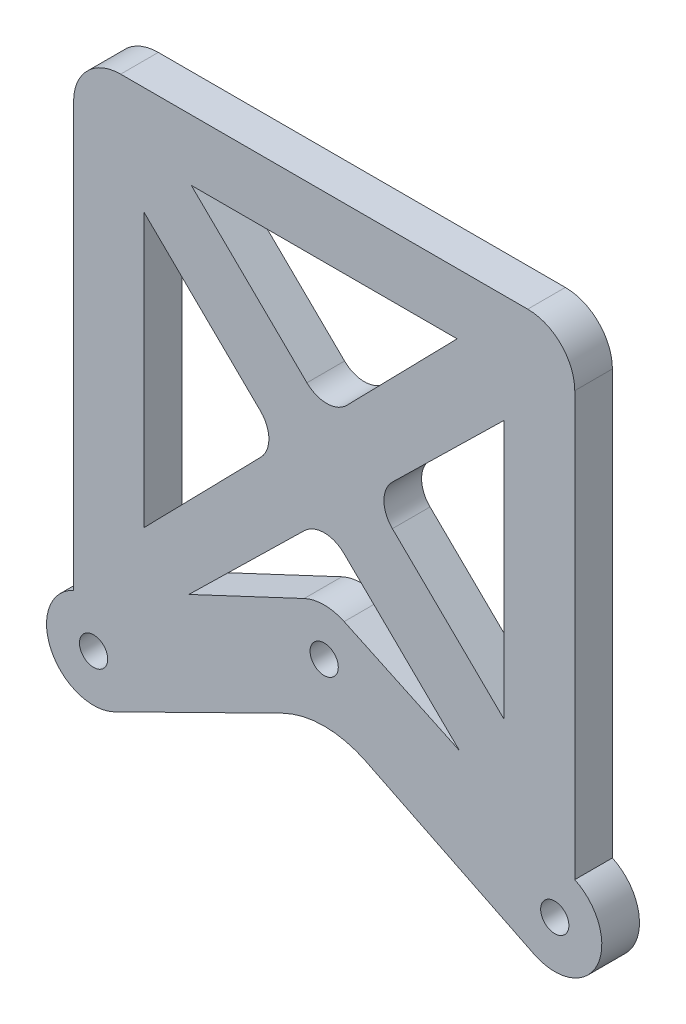
ISO-10303-21;
HEADER;
FILE_DESCRIPTION(('STEP AP214'),'2;1');
FILE_NAME('part.step','',(''),(''),'','','');
FILE_SCHEMA(('AUTOMOTIVE_DESIGN { 1 0 10303 214 1 1 1 1 }'));
ENDSEC;
DATA;
#1=APPLICATION_CONTEXT('core data for automotive mechanical design processes');
#2=APPLICATION_PROTOCOL_DEFINITION('international standard','automotive_design',2000,#1);
#3=PRODUCT_CONTEXT('',#1,'mechanical');
#4=PRODUCT('Part','Part','',(#3));
#5=PRODUCT_RELATED_PRODUCT_CATEGORY('part','',(#4));
#6=PRODUCT_DEFINITION_FORMATION('','',#4);
#7=PRODUCT_DEFINITION_CONTEXT('part definition',#1,'design');
#8=PRODUCT_DEFINITION('design','',#6,#7);
#9=PRODUCT_DEFINITION_SHAPE('','',#8);
#10=(LENGTH_UNIT() NAMED_UNIT(*) SI_UNIT(.MILLI.,.METRE.));
#11=(NAMED_UNIT(*) PLANE_ANGLE_UNIT() SI_UNIT($,.RADIAN.));
#12=(NAMED_UNIT(*) SI_UNIT($,.STERADIAN.) SOLID_ANGLE_UNIT());
#13=UNCERTAINTY_MEASURE_WITH_UNIT(LENGTH_MEASURE(1.E-05),#10,'distance_accuracy_value','');
#14=(GEOMETRIC_REPRESENTATION_CONTEXT(3) GLOBAL_UNCERTAINTY_ASSIGNED_CONTEXT((#13)) GLOBAL_UNIT_ASSIGNED_CONTEXT((#10,
#11,#12)) REPRESENTATION_CONTEXT('',''));
#15=CARTESIAN_POINT('',(0.,0.,0.));
#16=DIRECTION('',(0.,0.,1.));
#17=DIRECTION('',(1.,0.,0.));
#18=AXIS2_PLACEMENT_3D('',#15,#16,#17);
#19=CARTESIAN_POINT('',(-11.0513236983321,10.8109381402595,4.));
#20=DIRECTION('',(0.714838532622868,-0.699289548239916,0.));
#21=DIRECTION('',(0.699289548239916,0.714838532622868,0.));
#22=AXIS2_PLACEMENT_3D('',#19,#20,#21);
#23=PLANE('',#22);
#24=DIRECTION('',(-0.699289548239916,-0.714838532622868,0.));
#25=VECTOR('',#24,1.);
#26=CARTESIAN_POINT('',(-11.0513236983321,10.8109381402595,0.));
#27=LINE('',#26,#25);
#28=CARTESIAN_POINT('',(14.1245356850693,36.5465928836305,0.));
#29=VERTEX_POINT('',#28);
#30=CARTESIAN_POINT('',(2.40844254340268,24.5699876983511,0.));
#31=VERTEX_POINT('',#30);
#32=EDGE_CURVE('E330',#29,#31,#27,.T.);
#33=ORIENTED_EDGE('',*,*,#32,.T.);
#34=DIRECTION('',(0.,0.,-1.));
#35=VECTOR('',#34,1.);
#36=CARTESIAN_POINT('',(2.40844254340268,24.5699876983511,4.));
#37=LINE('',#36,#35);
#38=CARTESIAN_POINT('',(2.40844254340268,24.5699876983511,4.));
#39=VERTEX_POINT('',#38);
#40=EDGE_CURVE('E11',#39,#31,#37,.T.);
#41=ORIENTED_EDGE('',*,*,#40,.F.);
#42=DIRECTION('',(-0.699289548239916,-0.714838532622868,0.));
#43=VECTOR('',#42,1.);
#44=CARTESIAN_POINT('',(-11.0513236983321,10.8109381402595,4.));
#45=LINE('',#44,#43);
#46=CARTESIAN_POINT('',(14.1245356850693,36.5465928836305,4.));
#47=VERTEX_POINT('',#46);
#48=EDGE_CURVE('E235',#47,#39,#45,.T.);
#49=ORIENTED_EDGE('',*,*,#48,.F.);
#50=DIRECTION('',(0.,0.,-1.));
#51=VECTOR('',#50,1.);
#52=CARTESIAN_POINT('',(14.1245356850693,36.5465928836305,4.));
#53=LINE('',#52,#51);
#54=EDGE_CURVE('E338',#47,#29,#53,.T.);
#55=ORIENTED_EDGE('',*,*,#54,.T.);
#56=EDGE_LOOP('',(#33,#41,#49,#55));
#57=FACE_BOUND('',#56,.T.);
#58=ADVANCED_FACE('F38',(#57),#23,.F.);
#59=CARTESIAN_POINT('',(0.26392694553406,26.6678563430708,4.));
#60=DIRECTION('',(0.,0.,-1.));
#61=DIRECTION('',(-1.,0.,0.));
#62=AXIS2_PLACEMENT_3D('',#59,#60,#61);
#63=CYLINDRICAL_SURFACE('',#62,3.);
#64=CARTESIAN_POINT('',(0.26392694553406,26.6678563430708,0.));
#65=DIRECTION('',(0.,0.,1.));
#66=DIRECTION('',(1.,0.,0.));
#67=AXIS2_PLACEMENT_3D('',#64,#65,#66);
#68=CIRCLE('',#67,3.);
#69=CARTESIAN_POINT('',(-1.8339416991857,24.5233407452022,0.));
#70=VERTEX_POINT('',#69);
#71=EDGE_CURVE('E241',#31,#70,#68,.F.);
#72=ORIENTED_EDGE('',*,*,#71,.T.);
#73=DIRECTION('',(0.,0.,-1.));
#74=VECTOR('',#73,1.);
#75=CARTESIAN_POINT('',(-1.8339416991857,24.5233407452022,4.));
#76=LINE('',#75,#74);
#77=CARTESIAN_POINT('',(-1.8339416991857,24.5233407452022,4.));
#78=VERTEX_POINT('',#77);
#79=EDGE_CURVE('E48',#78,#70,#76,.T.);
#80=ORIENTED_EDGE('',*,*,#79,.F.);
#81=CARTESIAN_POINT('',(0.26392694553406,26.6678563430708,4.));
#82=DIRECTION('',(0.,0.,1.));
#83=DIRECTION('',(1.,0.,0.));
#84=AXIS2_PLACEMENT_3D('',#81,#82,#83);
#85=CIRCLE('',#84,3.);
#86=EDGE_CURVE('E229',#39,#78,#85,.F.);
#87=ORIENTED_EDGE('',*,*,#86,.F.);
#88=ORIENTED_EDGE('',*,*,#40,.T.);
#89=EDGE_LOOP('',(#72,#80,#87,#88));
#90=FACE_BOUND('',#89,.T.);
#91=ADVANCED_FACE('F240',(#90),#63,.F.);
#92=CARTESIAN_POINT('',(11.361897597015,11.614533960223,4.));
#93=DIRECTION('',(0.699289548239916,0.714838532622868,0.));
#94=DIRECTION('',(-0.714838532622868,0.699289548239916,0.));
#95=AXIS2_PLACEMENT_3D('',#92,#93,#94);
#96=PLANE('',#95);
#97=DIRECTION('',(0.714838532622868,-0.699289548239916,0.));
#98=VECTOR('',#97,1.);
#99=CARTESIAN_POINT('',(11.361897597015,11.614533960223,0.));
#100=LINE('',#99,#98);
#101=CARTESIAN_POINT('',(-14.1245356850693,36.5465928836305,0.));
#102=VERTEX_POINT('',#101);
#103=EDGE_CURVE('E334',#102,#70,#100,.T.);
#104=ORIENTED_EDGE('',*,*,#103,.F.);
#105=DIRECTION('',(0.,0.,-1.));
#106=VECTOR('',#105,1.);
#107=CARTESIAN_POINT('',(-14.1245356850693,36.5465928836305,4.));
#108=LINE('',#107,#106);
#109=CARTESIAN_POINT('',(-14.1245356850693,36.5465928836305,4.));
#110=VERTEX_POINT('',#109);
#111=EDGE_CURVE('E145',#110,#102,#108,.T.);
#112=ORIENTED_EDGE('',*,*,#111,.F.);
#113=DIRECTION('',(0.714838532622868,-0.699289548239916,0.));
#114=VECTOR('',#113,1.);
#115=CARTESIAN_POINT('',(11.361897597015,11.614533960223,4.));
#116=LINE('',#115,#114);
#117=EDGE_CURVE('E233',#110,#78,#116,.T.);
#118=ORIENTED_EDGE('',*,*,#117,.T.);
#119=ORIENTED_EDGE('',*,*,#79,.T.);
#120=EDGE_LOOP('',(#104,#112,#118,#119));
#121=FACE_BOUND('',#120,.T.);
#122=ADVANCED_FACE('F246',(#121),#96,.T.);
#123=CARTESIAN_POINT('',(6.41747266291537,6.5601677488992,4.));
#124=DIRECTION('',(0.699289548239916,0.714838532622867,0.));
#125=DIRECTION('',(-0.714838532622867,0.699289548239916,0.));
#126=AXIS2_PLACEMENT_3D('',#123,#124,#125);
#127=PLANE('',#126);
#128=DIRECTION('',(0.714838532622867,-0.699289548239916,0.));
#129=VECTOR('',#128,1.);
#130=CARTESIAN_POINT('',(6.41747266291537,6.5601677488992,0.));
#131=LINE('',#130,#129);
#132=CARTESIAN_POINT('',(-19.1245356850694,31.5465928836304,0.));
#133=VERTEX_POINT('',#132);
#134=CARTESIAN_POINT('',(-6.77836663328532,19.4689745338785,0.));
#135=VERTEX_POINT('',#134);
#136=EDGE_CURVE('E321',#133,#135,#131,.T.);
#137=ORIENTED_EDGE('',*,*,#136,.T.);
#138=DIRECTION('',(0.,0.,-1.));
#139=VECTOR('',#138,1.);
#140=CARTESIAN_POINT('',(-6.77836663328532,19.4689745338785,4.));
#141=LINE('',#140,#139);
#142=CARTESIAN_POINT('',(-6.77836663328532,19.4689745338785,4.));
#143=VERTEX_POINT('',#142);
#144=EDGE_CURVE('E340',#143,#135,#141,.T.);
#145=ORIENTED_EDGE('',*,*,#144,.F.);
#146=DIRECTION('',(0.714838532622867,-0.699289548239916,0.));
#147=VECTOR('',#146,1.);
#148=CARTESIAN_POINT('',(6.41747266291537,6.5601677488992,4.));
#149=LINE('',#148,#147);
#150=CARTESIAN_POINT('',(-19.1245356850694,31.5465928836304,4.));
#151=VERTEX_POINT('',#150);
#152=EDGE_CURVE('E465',#151,#143,#149,.T.);
#153=ORIENTED_EDGE('',*,*,#152,.F.);
#154=DIRECTION('',(0.,0.,-1.));
#155=VECTOR('',#154,1.);
#156=CARTESIAN_POINT('',(-19.1245356850694,31.5465928836304,4.));
#157=LINE('',#156,#155);
#158=EDGE_CURVE('E342',#151,#133,#157,.T.);
#159=ORIENTED_EDGE('',*,*,#158,.T.);
#160=EDGE_LOOP('',(#137,#145,#153,#159));
#161=FACE_BOUND('',#160,.T.);
#162=ADVANCED_FACE('F485',(#161),#127,.F.);
#163=CARTESIAN_POINT('',(-8.87623527800505,17.3244589360099,4.));
#164=DIRECTION('',(0.,0.,-1.));
#165=DIRECTION('',(-1.,0.,0.));
#166=AXIS2_PLACEMENT_3D('',#163,#164,#165);
#167=CYLINDRICAL_SURFACE('',#166,3.);
#168=CARTESIAN_POINT('',(-8.87623527800505,17.3244589360099,0.));
#169=DIRECTION('',(0.,0.,1.));
#170=DIRECTION('',(1.,0.,0.));
#171=AXIS2_PLACEMENT_3D('',#168,#169,#170);
#172=CIRCLE('',#171,3.);
#173=CARTESIAN_POINT('',(-6.73171968013646,15.2265902912901,0.));
#174=VERTEX_POINT('',#173);
#175=EDGE_CURVE('E324',#135,#174,#172,.F.);
#176=ORIENTED_EDGE('',*,*,#175,.T.);
#177=DIRECTION('',(0.,0.,-1.));
#178=VECTOR('',#177,1.);
#179=CARTESIAN_POINT('',(-6.73171968013646,15.2265902912901,4.));
#180=LINE('',#179,#178);
#181=CARTESIAN_POINT('',(-6.73171968013646,15.2265902912901,4.));
#182=VERTEX_POINT('',#181);
#183=EDGE_CURVE('E349',#182,#174,#180,.T.);
#184=ORIENTED_EDGE('',*,*,#183,.F.);
#185=CARTESIAN_POINT('',(-8.87623527800505,17.3244589360099,4.));
#186=DIRECTION('',(0.,0.,1.));
#187=DIRECTION('',(1.,0.,0.));
#188=AXIS2_PLACEMENT_3D('',#185,#186,#187);
#189=CIRCLE('',#188,3.);
#190=EDGE_CURVE('E468',#143,#182,#189,.F.);
#191=ORIENTED_EDGE('',*,*,#190,.F.);
#192=ORIENTED_EDGE('',*,*,#144,.T.);
#193=EDGE_LOOP('',(#176,#184,#191,#192));
#194=FACE_BOUND('',#193,.T.);
#195=ADVANCED_FACE('F487',(#194),#167,.F.);
#196=CARTESIAN_POINT('',(-11.0513236983321,10.8109381402595,4.));
#197=DIRECTION('',(0.714838532622868,-0.699289548239916,0.));
#198=DIRECTION('',(0.699289548239916,0.714838532622868,0.));
#199=AXIS2_PLACEMENT_3D('',#196,#197,#198);
#200=PLANE('',#199);
#201=DIRECTION('',(-0.699289548239916,-0.714838532622868,0.));
#202=VECTOR('',#201,1.);
#203=CARTESIAN_POINT('',(-11.0513236983321,10.8109381402595,0.));
#204=LINE('',#203,#202);
#205=CARTESIAN_POINT('',(-19.1245356850694,2.55821503767902,0.));
#206=VERTEX_POINT('',#205);
#207=EDGE_CURVE('E326',#174,#206,#204,.T.);
#208=ORIENTED_EDGE('',*,*,#207,.T.);
#209=DIRECTION('',(0.,0.,-1.));
#210=VECTOR('',#209,1.);
#211=CARTESIAN_POINT('',(-19.1245356850694,2.55821503767902,4.));
#212=LINE('',#211,#210);
#213=CARTESIAN_POINT('',(-19.1245356850694,2.55821503767902,4.));
#214=VERTEX_POINT('',#213);
#215=EDGE_CURVE('E345',#214,#206,#212,.T.);
#216=ORIENTED_EDGE('',*,*,#215,.F.);
#217=DIRECTION('',(-0.699289548239916,-0.714838532622868,0.));
#218=VECTOR('',#217,1.);
#219=CARTESIAN_POINT('',(-11.0513236983321,10.8109381402595,4.));
#220=LINE('',#219,#218);
#221=EDGE_CURVE('E470',#182,#214,#220,.T.);
#222=ORIENTED_EDGE('',*,*,#221,.F.);
#223=ORIENTED_EDGE('',*,*,#183,.T.);
#224=EDGE_LOOP('',(#208,#216,#222,#223));
#225=FACE_BOUND('',#224,.T.);
#226=ADVANCED_FACE('F491',(#225),#200,.F.);
#227=CARTESIAN_POINT('',(0.,8.6412972507373,4.));
#228=DIRECTION('',(0.,0.,-1.));
#229=DIRECTION('',(-1.,0.,0.));
#230=AXIS2_PLACEMENT_3D('',#227,#228,#229);
#231=CYLINDRICAL_SURFACE('',#230,3.00000000000001);
#232=CARTESIAN_POINT('',(0.,8.6412972507373,0.));
#233=DIRECTION('',(0.,0.,1.));
#234=DIRECTION('',(1.,0.,0.));
#235=AXIS2_PLACEMENT_3D('',#232,#233,#234);
#236=CIRCLE('',#235,3.00000000000001);
#237=CARTESIAN_POINT('',(2.09786864471984,10.7858128486059,0.));
#238=VERTEX_POINT('',#237);
#239=CARTESIAN_POINT('',(-2.09786864471966,10.7858128486059,0.));
#240=VERTEX_POINT('',#239);
#241=EDGE_CURVE('E303',#238,#240,#236,.T.);
#242=ORIENTED_EDGE('',*,*,#241,.F.);
#243=DIRECTION('',(0.,0.,-1.));
#244=VECTOR('',#243,1.);
#245=CARTESIAN_POINT('',(2.09786864471984,10.7858128486059,4.));
#246=LINE('',#245,#244);
#247=CARTESIAN_POINT('',(2.09786864471984,10.7858128486059,4.));
#248=VERTEX_POINT('',#247);
#249=EDGE_CURVE('E346',#248,#238,#246,.T.);
#250=ORIENTED_EDGE('',*,*,#249,.F.);
#251=CARTESIAN_POINT('',(0.,8.6412972507373,4.));
#252=DIRECTION('',(0.,0.,1.));
#253=DIRECTION('',(1.,0.,0.));
#254=AXIS2_PLACEMENT_3D('',#251,#252,#253);
#255=CIRCLE('',#254,3.00000000000001);
#256=CARTESIAN_POINT('',(-2.09786864471966,10.7858128486059,4.));
#257=VERTEX_POINT('',#256);
#258=EDGE_CURVE('E450',#248,#257,#255,.T.);
#259=ORIENTED_EDGE('',*,*,#258,.T.);
#260=DIRECTION('',(0.,0.,-1.));
#261=VECTOR('',#260,1.);
#262=CARTESIAN_POINT('',(-2.09786864471966,10.7858128486059,4.));
#263=LINE('',#262,#261);
#264=EDGE_CURVE('E354',#257,#240,#263,.T.);
#265=ORIENTED_EDGE('',*,*,#264,.T.);
#266=EDGE_LOOP('',(#242,#250,#259,#265));
#267=FACE_BOUND('',#266,.T.);
#268=ADVANCED_FACE('F524',(#267),#231,.F.);
#269=CARTESIAN_POINT('',(6.41747266291542,6.56016774889927,4.));
#270=DIRECTION('',(0.699289548239915,0.714838532622868,0.));
#271=DIRECTION('',(-0.714838532622868,0.699289548239915,0.));
#272=AXIS2_PLACEMENT_3D('',#269,#270,#271);
#273=PLANE('',#272);
#274=DIRECTION('',(0.714838532622868,-0.699289548239915,0.));
#275=VECTOR('',#274,1.);
#276=CARTESIAN_POINT('',(6.41747266291542,6.56016774889927,0.));
#277=LINE('',#276,#275);
#278=CARTESIAN_POINT('',(14.3745356850694,-1.22381527963478,0.));
#279=VERTEX_POINT('',#278);
#280=EDGE_CURVE('E306',#238,#279,#277,.T.);
#281=ORIENTED_EDGE('',*,*,#280,.T.);
#282=DIRECTION('',(0.,0.,-1.));
#283=VECTOR('',#282,1.);
#284=CARTESIAN_POINT('',(14.3745356850694,-1.22381527963478,4.));
#285=LINE('',#284,#283);
#286=CARTESIAN_POINT('',(14.3745356850694,-1.22381527963478,4.));
#287=VERTEX_POINT('',#286);
#288=EDGE_CURVE('E363',#287,#279,#285,.T.);
#289=ORIENTED_EDGE('',*,*,#288,.F.);
#290=DIRECTION('',(0.714838532622868,-0.699289548239915,0.));
#291=VECTOR('',#290,1.);
#292=CARTESIAN_POINT('',(6.41747266291542,6.56016774889927,4.));
#293=LINE('',#292,#291);
#294=EDGE_CURVE('E453',#248,#287,#293,.T.);
#295=ORIENTED_EDGE('',*,*,#294,.F.);
#296=ORIENTED_EDGE('',*,*,#249,.T.);
#297=EDGE_LOOP('',(#281,#289,#295,#296));
#298=FACE_BOUND('',#297,.T.);
#299=ADVANCED_FACE('F545',(#298),#273,.F.);
#300=CARTESIAN_POINT('',(2.12453568506931,4.52618472036515,4.));
#301=DIRECTION('',(0.424907137013864,0.905236944073032,0.));
#302=DIRECTION('',(-0.905236944073032,0.424907137013864,0.));
#303=AXIS2_PLACEMENT_3D('',#300,#301,#302);
#304=PLANE('',#303);
#305=DIRECTION('',(0.905236944073032,-0.424907137013864,0.));
#306=VECTOR('',#305,1.);
#307=CARTESIAN_POINT('',(2.12453568506931,4.52618472036515,0.));
#308=LINE('',#307,#306);
#309=CARTESIAN_POINT('',(2.12453568506934,4.52618472036513,0.));
#310=VERTEX_POINT('',#309);
#311=EDGE_CURVE('E309',#310,#279,#308,.T.);
#312=ORIENTED_EDGE('',*,*,#311,.F.);
#313=DIRECTION('',(0.,0.,-1.));
#314=VECTOR('',#313,1.);
#315=CARTESIAN_POINT('',(2.12453568506934,4.52618472036513,4.));
#316=LINE('',#315,#314);
#317=CARTESIAN_POINT('',(2.12453568506934,4.52618472036513,4.));
#318=VERTEX_POINT('',#317);
#319=EDGE_CURVE('E361',#318,#310,#316,.T.);
#320=ORIENTED_EDGE('',*,*,#319,.F.);
#321=DIRECTION('',(0.905236944073032,-0.424907137013864,0.));
#322=VECTOR('',#321,1.);
#323=CARTESIAN_POINT('',(2.12453568506931,4.52618472036515,4.));
#324=LINE('',#323,#322);
#325=EDGE_CURVE('E455',#318,#287,#324,.T.);
#326=ORIENTED_EDGE('',*,*,#325,.T.);
#327=ORIENTED_EDGE('',*,*,#288,.T.);
#328=EDGE_LOOP('',(#312,#320,#326,#327));
#329=FACE_BOUND('',#328,.T.);
#330=ADVANCED_FACE('F541',(#329),#304,.T.);
#331=CARTESIAN_POINT('',(0.,0.,4.));
#332=DIRECTION('',(0.,0.,-1.));
#333=DIRECTION('',(-1.,0.,0.));
#334=AXIS2_PLACEMENT_3D('',#331,#332,#333);
#335=CYLINDRICAL_SURFACE('',#334,4.99999999999999);
#336=CARTESIAN_POINT('',(0.,0.,0.));
#337=DIRECTION('',(0.,0.,1.));
#338=DIRECTION('',(1.,0.,0.));
#339=AXIS2_PLACEMENT_3D('',#336,#337,#338);
#340=CIRCLE('',#339,4.99999999999999);
#341=CARTESIAN_POINT('',(-2.12453568506935,4.52618472036514,0.));
#342=VERTEX_POINT('',#341);
#343=EDGE_CURVE('E312',#310,#342,#340,.T.);
#344=ORIENTED_EDGE('',*,*,#343,.T.);
#345=DIRECTION('',(0.,0.,-1.));
#346=VECTOR('',#345,1.);
#347=CARTESIAN_POINT('',(-2.12453568506935,4.52618472036514,4.));
#348=LINE('',#347,#346);
#349=CARTESIAN_POINT('',(-2.12453568506935,4.52618472036514,4.));
#350=VERTEX_POINT('',#349);
#351=EDGE_CURVE('E359',#350,#342,#348,.T.);
#352=ORIENTED_EDGE('',*,*,#351,.F.);
#353=CARTESIAN_POINT('',(0.,0.,4.));
#354=DIRECTION('',(0.,0.,1.));
#355=DIRECTION('',(1.,0.,0.));
#356=AXIS2_PLACEMENT_3D('',#353,#354,#355);
#357=CIRCLE('',#356,4.99999999999999);
#358=EDGE_CURVE('E458',#318,#350,#357,.T.);
#359=ORIENTED_EDGE('',*,*,#358,.F.);
#360=ORIENTED_EDGE('',*,*,#319,.T.);
#361=EDGE_LOOP('',(#344,#352,#359,#360));
#362=FACE_BOUND('',#361,.T.);
#363=ADVANCED_FACE('F537',(#362),#335,.T.);
#364=CARTESIAN_POINT('',(-2.12453568506935,4.52618472036514,4.));
#365=DIRECTION('',(-0.424907137013871,0.905236944073029,0.));
#366=DIRECTION('',(-0.905236944073029,-0.424907137013871,0.));
#367=AXIS2_PLACEMENT_3D('',#364,#365,#366);
#368=PLANE('',#367);
#369=DIRECTION('',(0.905236944073029,0.424907137013871,0.));
#370=VECTOR('',#369,1.);
#371=CARTESIAN_POINT('',(-2.12453568506935,4.52618472036514,0.));
#372=LINE('',#371,#370);
#373=CARTESIAN_POINT('',(-14.3745356850694,-1.22381527963486,0.));
#374=VERTEX_POINT('',#373);
#375=EDGE_CURVE('E315',#374,#342,#372,.T.);
#376=ORIENTED_EDGE('',*,*,#375,.F.);
#377=DIRECTION('',(0.,0.,-1.));
#378=VECTOR('',#377,1.);
#379=CARTESIAN_POINT('',(-14.3745356850694,-1.22381527963486,4.));
#380=LINE('',#379,#378);
#381=CARTESIAN_POINT('',(-14.3745356850694,-1.22381527963486,4.));
#382=VERTEX_POINT('',#381);
#383=EDGE_CURVE('E356',#382,#374,#380,.T.);
#384=ORIENTED_EDGE('',*,*,#383,.F.);
#385=DIRECTION('',(0.905236944073029,0.424907137013871,0.));
#386=VECTOR('',#385,1.);
#387=CARTESIAN_POINT('',(-2.12453568506935,4.52618472036514,4.));
#388=LINE('',#387,#386);
#389=EDGE_CURVE('E460',#382,#350,#388,.T.);
#390=ORIENTED_EDGE('',*,*,#389,.T.);
#391=ORIENTED_EDGE('',*,*,#351,.T.);
#392=EDGE_LOOP('',(#376,#384,#390,#391));
#393=FACE_BOUND('',#392,.T.);
#394=ADVANCED_FACE('F533',(#393),#368,.T.);
#395=CARTESIAN_POINT('',(9.34565691508779,17.7836698340643,4.));
#396=DIRECTION('',(0.,0.,-1.));
#397=DIRECTION('',(-1.,0.,0.));
#398=AXIS2_PLACEMENT_3D('',#395,#396,#397);
#399=CYLINDRICAL_SURFACE('',#398,3.);
#400=CARTESIAN_POINT('',(9.34565691508779,17.7836698340643,0.));
#401=DIRECTION('',(0.,0.,1.));
#402=DIRECTION('',(1.,0.,0.));
#403=AXIS2_PLACEMENT_3D('',#400,#401,#402);
#404=CIRCLE('',#403,3.);
#405=CARTESIAN_POINT('',(7.24778827036805,19.9281854319329,0.));
#406=VERTEX_POINT('',#405);
#407=CARTESIAN_POINT('',(7.24778827036805,15.6391542361956,0.));
#408=VERTEX_POINT('',#407);
#409=EDGE_CURVE('E291',#406,#408,#404,.T.);
#410=ORIENTED_EDGE('',*,*,#409,.F.);
#411=DIRECTION('',(0.,0.,-1.));
#412=VECTOR('',#411,1.);
#413=CARTESIAN_POINT('',(7.24778827036805,19.9281854319329,4.));
#414=LINE('',#413,#412);
#415=CARTESIAN_POINT('',(7.24778827036805,19.9281854319329,4.));
#416=VERTEX_POINT('',#415);
#417=EDGE_CURVE('E357',#416,#406,#414,.T.);
#418=ORIENTED_EDGE('',*,*,#417,.F.);
#419=CARTESIAN_POINT('',(9.34565691508779,17.7836698340643,4.));
#420=DIRECTION('',(0.,0.,1.));
#421=DIRECTION('',(1.,0.,0.));
#422=AXIS2_PLACEMENT_3D('',#419,#420,#421);
#423=CIRCLE('',#422,3.);
#424=CARTESIAN_POINT('',(7.24778827036805,15.6391542361956,4.));
#425=VERTEX_POINT('',#424);
#426=EDGE_CURVE('E439',#416,#425,#423,.T.);
#427=ORIENTED_EDGE('',*,*,#426,.T.);
#428=DIRECTION('',(0.,0.,-1.));
#429=VECTOR('',#428,1.);
#430=CARTESIAN_POINT('',(7.24778827036805,15.6391542361956,4.));
#431=LINE('',#430,#429);
#432=EDGE_CURVE('E366',#425,#408,#431,.T.);
#433=ORIENTED_EDGE('',*,*,#432,.T.);
#434=EDGE_LOOP('',(#410,#418,#427,#433));
#435=FACE_BOUND('',#434,.T.);
#436=ADVANCED_FACE('F536',(#435),#399,.F.);
#437=CARTESIAN_POINT('',(-6.41747266291537,6.56016774889921,4.));
#438=DIRECTION('',(-0.699289548239916,0.714838532622868,0.));
#439=DIRECTION('',(-0.714838532622868,-0.699289548239916,0.));
#440=AXIS2_PLACEMENT_3D('',#437,#438,#439);
#441=PLANE('',#440);
#442=DIRECTION('',(0.714838532622868,0.699289548239916,0.));
#443=VECTOR('',#442,1.);
#444=CARTESIAN_POINT('',(-6.41747266291537,6.56016774889921,0.));
#445=LINE('',#444,#443);
#446=CARTESIAN_POINT('',(19.1245356850694,31.5465928836304,0.));
#447=VERTEX_POINT('',#446);
#448=EDGE_CURVE('E294',#406,#447,#445,.T.);
#449=ORIENTED_EDGE('',*,*,#448,.T.);
#450=DIRECTION('',(0.,0.,-1.));
#451=VECTOR('',#450,1.);
#452=CARTESIAN_POINT('',(19.1245356850694,31.5465928836304,4.));
#453=LINE('',#452,#451);
#454=CARTESIAN_POINT('',(19.1245356850694,31.5465928836304,4.));
#455=VERTEX_POINT('',#454);
#456=EDGE_CURVE('E370',#455,#447,#453,.T.);
#457=ORIENTED_EDGE('',*,*,#456,.F.);
#458=DIRECTION('',(0.714838532622868,0.699289548239916,0.));
#459=VECTOR('',#458,1.);
#460=CARTESIAN_POINT('',(-6.41747266291537,6.56016774889921,4.));
#461=LINE('',#460,#459);
#462=EDGE_CURVE('E442',#416,#455,#461,.T.);
#463=ORIENTED_EDGE('',*,*,#462,.F.);
#464=ORIENTED_EDGE('',*,*,#417,.T.);
#465=EDGE_LOOP('',(#449,#457,#463,#464));
#466=FACE_BOUND('',#465,.T.);
#467=ADVANCED_FACE('F560',(#466),#441,.F.);
#468=CARTESIAN_POINT('',(19.1245356850694,0.,4.));
#469=DIRECTION('',(-1.,0.,0.));
#470=DIRECTION('',(0.,0.,1.));
#471=AXIS2_PLACEMENT_3D('',#468,#469,#470);
#472=PLANE('',#471);
#473=DIRECTION('',(0.,1.,0.));
#474=VECTOR('',#473,1.);
#475=CARTESIAN_POINT('',(19.1245356850694,0.,0.));
#476=LINE('',#475,#474);
#477=CARTESIAN_POINT('',(19.1245356850694,4.0207467844981,0.));
#478=VERTEX_POINT('',#477);
#479=EDGE_CURVE('E297',#478,#447,#476,.T.);
#480=ORIENTED_EDGE('',*,*,#479,.F.);
#481=DIRECTION('',(0.,0.,-1.));
#482=VECTOR('',#481,1.);
#483=CARTESIAN_POINT('',(19.1245356850694,4.0207467844981,4.));
#484=LINE('',#483,#482);
#485=CARTESIAN_POINT('',(19.1245356850694,4.0207467844981,4.));
#486=VERTEX_POINT('',#485);
#487=EDGE_CURVE('E368',#486,#478,#484,.T.);
#488=ORIENTED_EDGE('',*,*,#487,.F.);
#489=DIRECTION('',(0.,1.,0.));
#490=VECTOR('',#489,1.);
#491=CARTESIAN_POINT('',(19.1245356850694,0.,4.));
#492=LINE('',#491,#490);
#493=EDGE_CURVE('E444',#486,#455,#492,.T.);
#494=ORIENTED_EDGE('',*,*,#493,.T.);
#495=ORIENTED_EDGE('',*,*,#456,.T.);
#496=EDGE_LOOP('',(#480,#488,#494,#495));
#497=FACE_BOUND('',#496,.T.);
#498=ADVANCED_FACE('F557',(#497),#472,.T.);
#499=CARTESIAN_POINT('',(-21.6245356850694,38.0261847203651,4.));
#500=DIRECTION('',(0.,0.,-1.));
#501=DIRECTION('',(-1.,0.,0.));
#502=AXIS2_PLACEMENT_3D('',#499,#500,#501);
#503=CYLINDRICAL_SURFACE('',#502,5.);
#504=CARTESIAN_POINT('',(-21.6245356850694,38.0261847203651,0.));
#505=DIRECTION('',(0.,0.,1.));
#506=DIRECTION('',(1.,0.,0.));
#507=AXIS2_PLACEMENT_3D('',#504,#505,#506);
#508=CIRCLE('',#507,5.);
#509=CARTESIAN_POINT('',(-26.6245356850694,38.0261847203651,0.));
#510=VERTEX_POINT('',#509);
#511=CARTESIAN_POINT('',(-21.6245356850693,43.0261847203651,0.));
#512=VERTEX_POINT('',#511);
#513=EDGE_CURVE('E261',#510,#512,#508,.F.);
#514=ORIENTED_EDGE('',*,*,#513,.F.);
#515=DIRECTION('',(0.,0.,-1.));
#516=VECTOR('',#515,1.);
#517=CARTESIAN_POINT('',(-26.6245356850694,38.0261847203651,4.));
#518=LINE('',#517,#516);
#519=CARTESIAN_POINT('',(-26.6245356850694,38.0261847203651,4.));
#520=VERTEX_POINT('',#519);
#521=EDGE_CURVE('E42',#520,#510,#518,.T.);
#522=ORIENTED_EDGE('',*,*,#521,.F.);
#523=CARTESIAN_POINT('',(-21.6245356850694,38.0261847203651,4.));
#524=DIRECTION('',(0.,0.,1.));
#525=DIRECTION('',(1.,0.,0.));
#526=AXIS2_PLACEMENT_3D('',#523,#524,#525);
#527=CIRCLE('',#526,5.);
#528=CARTESIAN_POINT('',(-21.6245356850693,43.0261847203651,4.));
#529=VERTEX_POINT('',#528);
#530=EDGE_CURVE('E420',#520,#529,#527,.F.);
#531=ORIENTED_EDGE('',*,*,#530,.T.);
#532=DIRECTION('',(0.,0.,-1.));
#533=VECTOR('',#532,1.);
#534=CARTESIAN_POINT('',(-21.6245356850693,43.0261847203651,4.));
#535=LINE('',#534,#533);
#536=EDGE_CURVE('E248',#529,#512,#535,.T.);
#537=ORIENTED_EDGE('',*,*,#536,.T.);
#538=EDGE_LOOP('',(#514,#522,#531,#537));
#539=FACE_BOUND('',#538,.T.);
#540=ADVANCED_FACE('F401',(#539),#503,.T.);
#541=CARTESIAN_POINT('',(-26.6245356850694,0.,4.));
#542=DIRECTION('',(-1.,0.,0.));
#543=DIRECTION('',(0.,0.,1.));
#544=AXIS2_PLACEMENT_3D('',#541,#542,#543);
#545=PLANE('',#544);
#546=DIRECTION('',(0.,1.,0.));
#547=VECTOR('',#546,1.);
#548=CARTESIAN_POINT('',(-26.6245356850694,0.,0.));
#549=LINE('',#548,#547);
#550=CARTESIAN_POINT('',(-26.6245356850694,-6.97381527963486,0.));
#551=VERTEX_POINT('',#550);
#552=EDGE_CURVE('E264',#551,#510,#549,.T.);
#553=ORIENTED_EDGE('',*,*,#552,.F.);
#554=DIRECTION('',(0.,0.,-1.));
#555=VECTOR('',#554,1.);
#556=CARTESIAN_POINT('',(-26.6245356850694,-6.97381527963486,4.));
#557=LINE('',#556,#555);
#558=CARTESIAN_POINT('',(-26.6245356850694,-6.97381527963486,4.));
#559=VERTEX_POINT('',#558);
#560=EDGE_CURVE('E391',#559,#551,#557,.T.);
#561=ORIENTED_EDGE('',*,*,#560,.F.);
#562=DIRECTION('',(0.,1.,0.));
#563=VECTOR('',#562,1.);
#564=CARTESIAN_POINT('',(-26.6245356850694,0.,4.));
#565=LINE('',#564,#563);
#566=EDGE_CURVE('E400',#559,#520,#565,.T.);
#567=ORIENTED_EDGE('',*,*,#566,.T.);
#568=ORIENTED_EDGE('',*,*,#521,.T.);
#569=EDGE_LOOP('',(#553,#561,#567,#568));
#570=FACE_BOUND('',#569,.T.);
#571=ADVANCED_FACE('F398',(#570),#545,.T.);
#572=CARTESIAN_POINT('',(-24.5,-11.5,4.));
#573=DIRECTION('',(0.,0.,-1.));
#574=DIRECTION('',(-1.,0.,0.));
#575=AXIS2_PLACEMENT_3D('',#572,#573,#574);
#576=CYLINDRICAL_SURFACE('',#575,5.);
#577=CARTESIAN_POINT('',(-24.5,-11.5,0.));
#578=DIRECTION('',(0.,0.,1.));
#579=DIRECTION('',(1.,0.,0.));
#580=AXIS2_PLACEMENT_3D('',#577,#578,#579);
#581=CIRCLE('',#580,5.);
#582=CARTESIAN_POINT('',(-22.3754643149307,-16.0261847203652,0.));
#583=VERTEX_POINT('',#582);
#584=EDGE_CURVE('E267',#551,#583,#581,.T.);
#585=ORIENTED_EDGE('',*,*,#584,.T.);
#586=DIRECTION('',(0.,0.,-1.));
#587=VECTOR('',#586,1.);
#588=CARTESIAN_POINT('',(-22.3754643149307,-16.0261847203652,4.));
#589=LINE('',#588,#587);
#590=CARTESIAN_POINT('',(-22.3754643149307,-16.0261847203652,4.));
#591=VERTEX_POINT('',#590);
#592=EDGE_CURVE('E389',#591,#583,#589,.T.);
#593=ORIENTED_EDGE('',*,*,#592,.F.);
#594=CARTESIAN_POINT('',(-24.5,-11.5,4.));
#595=DIRECTION('',(0.,0.,1.));
#596=DIRECTION('',(1.,0.,0.));
#597=AXIS2_PLACEMENT_3D('',#594,#595,#596);
#598=CIRCLE('',#597,5.);
#599=EDGE_CURVE('E409',#559,#591,#598,.T.);
#600=ORIENTED_EDGE('',*,*,#599,.F.);
#601=ORIENTED_EDGE('',*,*,#560,.T.);
#602=EDGE_LOOP('',(#585,#593,#600,#601));
#603=FACE_BOUND('',#602,.T.);
#604=ADVANCED_FACE('F407',(#603),#576,.T.);
#605=CARTESIAN_POINT('',(1.9824885506456,-4.02306898936803,4.));
#606=DIRECTION('',(-0.442025114805722,0.897002674400132,0.));
#607=DIRECTION('',(-0.897002674400132,-0.442025114805722,0.));
#608=AXIS2_PLACEMENT_3D('',#605,#606,#607);
#609=PLANE('',#608);
#610=DIRECTION('',(0.897002674400132,0.442025114805722,0.));
#611=VECTOR('',#610,1.);
#612=CARTESIAN_POINT('',(1.9824885506456,-4.02306898936803,0.));
#613=LINE('',#612,#611);
#614=CARTESIAN_POINT('',(-4.42025114788611,-7.17821203529853,0.));
#615=VERTEX_POINT('',#614);
#616=EDGE_CURVE('E270',#583,#615,#613,.T.);
#617=ORIENTED_EDGE('',*,*,#616,.T.);
#618=DIRECTION('',(0.,0.,-1.));
#619=VECTOR('',#618,1.);
#620=CARTESIAN_POINT('',(-4.42025114788611,-7.17821203529853,4.));
#621=LINE('',#620,#619);
#622=CARTESIAN_POINT('',(-4.42025114788611,-7.17821203529853,4.));
#623=VERTEX_POINT('',#622);
#624=EDGE_CURVE('E386',#623,#615,#621,.T.);
#625=ORIENTED_EDGE('',*,*,#624,.F.);
#626=DIRECTION('',(0.897002674400132,0.442025114805722,0.));
#627=VECTOR('',#626,1.);
#628=CARTESIAN_POINT('',(1.9824885506456,-4.02306898936803,4.));
#629=LINE('',#628,#627);
#630=EDGE_CURVE('E414',#591,#623,#629,.T.);
#631=ORIENTED_EDGE('',*,*,#630,.F.);
#632=ORIENTED_EDGE('',*,*,#592,.T.);
#633=EDGE_LOOP('',(#617,#625,#631,#632));
#634=FACE_BOUND('',#633,.T.);
#635=ADVANCED_FACE('F411',(#634),#609,.F.);
#636=CARTESIAN_POINT('',(1.71179043162439E-10,-16.1482387792998,4.));
#637=DIRECTION('',(0.,0.,-1.));
#638=DIRECTION('',(-1.,0.,0.));
#639=AXIS2_PLACEMENT_3D('',#636,#637,#638);
#640=CYLINDRICAL_SURFACE('',#639,10.);
#641=CARTESIAN_POINT('',(1.71179043162439E-10,-16.1482387792998,0.));
#642=DIRECTION('',(0.,0.,1.));
#643=DIRECTION('',(1.,0.,0.));
#644=AXIS2_PLACEMENT_3D('',#641,#642,#643);
#645=CIRCLE('',#644,10.);
#646=CARTESIAN_POINT('',(4.42025114829614,-7.17821203533187,0.));
#647=VERTEX_POINT('',#646);
#648=EDGE_CURVE('E273',#615,#647,#645,.F.);
#649=ORIENTED_EDGE('',*,*,#648,.T.);
#650=DIRECTION('',(0.,0.,-1.));
#651=VECTOR('',#650,1.);
#652=CARTESIAN_POINT('',(4.42025114829614,-7.17821203533187,4.));
#653=LINE('',#652,#651);
#654=CARTESIAN_POINT('',(4.42025114829614,-7.17821203533187,4.));
#655=VERTEX_POINT('',#654);
#656=EDGE_CURVE('E384',#655,#647,#653,.T.);
#657=ORIENTED_EDGE('',*,*,#656,.F.);
#658=CARTESIAN_POINT('',(1.71179043162439E-10,-16.1482387792998,4.));
#659=DIRECTION('',(0.,0.,1.));
#660=DIRECTION('',(1.,0.,0.));
#661=AXIS2_PLACEMENT_3D('',#658,#659,#660);
#662=CIRCLE('',#661,10.);
#663=EDGE_CURVE('E416',#623,#655,#662,.F.);
#664=ORIENTED_EDGE('',*,*,#663,.F.);
#665=ORIENTED_EDGE('',*,*,#624,.T.);
#666=EDGE_LOOP('',(#649,#657,#664,#665));
#667=FACE_BOUND('',#666,.T.);
#668=ADVANCED_FACE('F586',(#667),#640,.F.);
#669=CARTESIAN_POINT('',(-1.98248855058527,-4.02306898916889,4.));
#670=DIRECTION('',(-0.442025114812503,-0.89700267439679,0.));
#671=DIRECTION('',(0.89700267439679,-0.442025114812503,0.));
#672=AXIS2_PLACEMENT_3D('',#669,#670,#671);
#673=PLANE('',#672);
#674=DIRECTION('',(-0.89700267439679,0.442025114812503,0.));
#675=VECTOR('',#674,1.);
#676=CARTESIAN_POINT('',(-1.98248855058527,-4.02306898916889,0.));
#677=LINE('',#676,#675);
#678=CARTESIAN_POINT('',(22.3754643149307,-16.0261847203651,0.));
#679=VERTEX_POINT('',#678);
#680=EDGE_CURVE('E276',#679,#647,#677,.T.);
#681=ORIENTED_EDGE('',*,*,#680,.F.);
#682=DIRECTION('',(0.,0.,-1.));
#683=VECTOR('',#682,1.);
#684=CARTESIAN_POINT('',(22.3754643149307,-16.0261847203651,4.));
#685=LINE('',#684,#683);
#686=CARTESIAN_POINT('',(22.3754643149307,-16.0261847203651,4.));
#687=VERTEX_POINT('',#686);
#688=EDGE_CURVE('E382',#687,#679,#685,.T.);
#689=ORIENTED_EDGE('',*,*,#688,.F.);
#690=DIRECTION('',(-0.89700267439679,0.442025114812503,0.));
#691=VECTOR('',#690,1.);
#692=CARTESIAN_POINT('',(-1.98248855058527,-4.02306898916889,4.));
#693=LINE('',#692,#691);
#694=EDGE_CURVE('E425',#687,#655,#693,.T.);
#695=ORIENTED_EDGE('',*,*,#694,.T.);
#696=ORIENTED_EDGE('',*,*,#656,.T.);
#697=EDGE_LOOP('',(#681,#689,#695,#696));
#698=FACE_BOUND('',#697,.T.);
#699=ADVANCED_FACE('F582',(#698),#673,.T.);
#700=CARTESIAN_POINT('',(24.5,-11.5,4.));
#701=DIRECTION('',(0.,0.,-1.));
#702=DIRECTION('',(-1.,0.,0.));
#703=AXIS2_PLACEMENT_3D('',#700,#701,#702);
#704=CYLINDRICAL_SURFACE('',#703,5.);
#705=CARTESIAN_POINT('',(24.5,-11.5,0.));
#706=DIRECTION('',(0.,0.,1.));
#707=DIRECTION('',(1.,0.,0.));
#708=AXIS2_PLACEMENT_3D('',#705,#706,#707);
#709=CIRCLE('',#708,5.);
#710=CARTESIAN_POINT('',(26.6245356850694,-6.97381527963485,0.));
#711=VERTEX_POINT('',#710);
#712=EDGE_CURVE('E279',#679,#711,#709,.T.);
#713=ORIENTED_EDGE('',*,*,#712,.T.);
#714=DIRECTION('',(0.,0.,-1.));
#715=VECTOR('',#714,1.);
#716=CARTESIAN_POINT('',(26.6245356850694,-6.97381527963485,4.));
#717=LINE('',#716,#715);
#718=CARTESIAN_POINT('',(26.6245356850694,-6.97381527963485,4.));
#719=VERTEX_POINT('',#718);
#720=EDGE_CURVE('E379',#719,#711,#717,.T.);
#721=ORIENTED_EDGE('',*,*,#720,.F.);
#722=CARTESIAN_POINT('',(24.5,-11.5,4.));
#723=DIRECTION('',(0.,0.,1.));
#724=DIRECTION('',(1.,0.,0.));
#725=AXIS2_PLACEMENT_3D('',#722,#723,#724);
#726=CIRCLE('',#725,5.);
#727=EDGE_CURVE('E428',#687,#719,#726,.T.);
#728=ORIENTED_EDGE('',*,*,#727,.F.);
#729=ORIENTED_EDGE('',*,*,#688,.T.);
#730=EDGE_LOOP('',(#713,#721,#728,#729));
#731=FACE_BOUND('',#730,.T.);
#732=ADVANCED_FACE('F578',(#731),#704,.T.);
#733=CARTESIAN_POINT('',(26.6245356850694,0.,4.));
#734=DIRECTION('',(-1.,0.,0.));
#735=DIRECTION('',(0.,0.,1.));
#736=AXIS2_PLACEMENT_3D('',#733,#734,#735);
#737=PLANE('',#736);
#738=DIRECTION('',(0.,1.,0.));
#739=VECTOR('',#738,1.);
#740=CARTESIAN_POINT('',(26.6245356850694,0.,0.));
#741=LINE('',#740,#739);
#742=CARTESIAN_POINT('',(26.6245356850694,38.0261847203651,0.));
#743=VERTEX_POINT('',#742);
#744=EDGE_CURVE('E282',#711,#743,#741,.T.);
#745=ORIENTED_EDGE('',*,*,#744,.T.);
#746=DIRECTION('',(0.,0.,-1.));
#747=VECTOR('',#746,1.);
#748=CARTESIAN_POINT('',(26.6245356850694,38.0261847203651,4.));
#749=LINE('',#748,#747);
#750=CARTESIAN_POINT('',(26.6245356850694,38.0261847203651,4.));
#751=VERTEX_POINT('',#750);
#752=EDGE_CURVE('E376',#751,#743,#749,.T.);
#753=ORIENTED_EDGE('',*,*,#752,.F.);
#754=DIRECTION('',(0.,1.,0.));
#755=VECTOR('',#754,1.);
#756=CARTESIAN_POINT('',(26.6245356850694,0.,4.));
#757=LINE('',#756,#755);
#758=EDGE_CURVE('E431',#719,#751,#757,.T.);
#759=ORIENTED_EDGE('',*,*,#758,.F.);
#760=ORIENTED_EDGE('',*,*,#720,.T.);
#761=EDGE_LOOP('',(#745,#753,#759,#760));
#762=FACE_BOUND('',#761,.T.);
#763=ADVANCED_FACE('F574',(#762),#737,.F.);
#764=CARTESIAN_POINT('',(21.6245356850694,38.0261847203651,4.));
#765=DIRECTION('',(0.,0.,-1.));
#766=DIRECTION('',(-1.,0.,0.));
#767=AXIS2_PLACEMENT_3D('',#764,#765,#766);
#768=CYLINDRICAL_SURFACE('',#767,5.);
#769=CARTESIAN_POINT('',(21.6245356850694,38.0261847203651,0.));
#770=DIRECTION('',(0.,0.,1.));
#771=DIRECTION('',(1.,0.,0.));
#772=AXIS2_PLACEMENT_3D('',#769,#770,#771);
#773=CIRCLE('',#772,5.);
#774=CARTESIAN_POINT('',(21.6245356850693,43.0261847203651,0.));
#775=VERTEX_POINT('',#774);
#776=EDGE_CURVE('E285',#743,#775,#773,.T.);
#777=ORIENTED_EDGE('',*,*,#776,.T.);
#778=DIRECTION('',(0.,0.,-1.));
#779=VECTOR('',#778,1.);
#780=CARTESIAN_POINT('',(21.6245356850693,43.0261847203651,4.));
#781=LINE('',#780,#779);
#782=CARTESIAN_POINT('',(21.6245356850693,43.0261847203651,4.));
#783=VERTEX_POINT('',#782);
#784=EDGE_CURVE('E374',#783,#775,#781,.T.);
#785=ORIENTED_EDGE('',*,*,#784,.F.);
#786=CARTESIAN_POINT('',(21.6245356850694,38.0261847203651,4.));
#787=DIRECTION('',(0.,0.,1.));
#788=DIRECTION('',(1.,0.,0.));
#789=AXIS2_PLACEMENT_3D('',#786,#787,#788);
#790=CIRCLE('',#789,5.);
#791=EDGE_CURVE('E434',#751,#783,#790,.T.);
#792=ORIENTED_EDGE('',*,*,#791,.F.);
#793=ORIENTED_EDGE('',*,*,#752,.T.);
#794=EDGE_LOOP('',(#777,#785,#792,#793));
#795=FACE_BOUND('',#794,.T.);
#796=ADVANCED_FACE('F521',(#795),#768,.T.);
#797=CARTESIAN_POINT('',(-19.1245356850694,0.,4.));
#798=DIRECTION('',(-1.,0.,0.));
#799=DIRECTION('',(0.,0.,1.));
#800=AXIS2_PLACEMENT_3D('',#797,#798,#799);
#801=PLANE('',#800);
#802=DIRECTION('',(0.,1.,0.));
#803=VECTOR('',#802,1.);
#804=CARTESIAN_POINT('',(-19.1245356850694,0.,0.));
#805=LINE('',#804,#803);
#806=EDGE_CURVE('E328',#206,#133,#805,.T.);
#807=ORIENTED_EDGE('',*,*,#806,.T.);
#808=ORIENTED_EDGE('',*,*,#158,.F.);
#809=DIRECTION('',(0.,1.,0.));
#810=VECTOR('',#809,1.);
#811=CARTESIAN_POINT('',(-19.1245356850694,0.,4.));
#812=LINE('',#811,#810);
#813=EDGE_CURVE('E472',#214,#151,#812,.T.);
#814=ORIENTED_EDGE('',*,*,#813,.F.);
#815=ORIENTED_EDGE('',*,*,#215,.T.);
#816=EDGE_LOOP('',(#807,#808,#814,#815));
#817=FACE_BOUND('',#816,.T.);
#818=ADVANCED_FACE('F481',(#817),#801,.F.);
#819=CARTESIAN_POINT('',(-6.41747266291533,6.5601677488992,4.));
#820=DIRECTION('',(-0.699289548239914,0.71483853262287,0.));
#821=DIRECTION('',(-0.71483853262287,-0.699289548239914,0.));
#822=AXIS2_PLACEMENT_3D('',#819,#820,#821);
#823=PLANE('',#822);
#824=DIRECTION('',(0.71483853262287,0.699289548239914,0.));
#825=VECTOR('',#824,1.);
#826=CARTESIAN_POINT('',(-6.41747266291533,6.5601677488992,0.));
#827=LINE('',#826,#825);
#828=EDGE_CURVE('E318',#374,#240,#827,.T.);
#829=ORIENTED_EDGE('',*,*,#828,.T.);
#830=ORIENTED_EDGE('',*,*,#264,.F.);
#831=DIRECTION('',(0.71483853262287,0.699289548239914,0.));
#832=VECTOR('',#831,1.);
#833=CARTESIAN_POINT('',(-6.41747266291533,6.5601677488992,4.));
#834=LINE('',#833,#832);
#835=EDGE_CURVE('E463',#382,#257,#834,.T.);
#836=ORIENTED_EDGE('',*,*,#835,.F.);
#837=ORIENTED_EDGE('',*,*,#383,.T.);
#838=EDGE_LOOP('',(#829,#830,#836,#837));
#839=FACE_BOUND('',#838,.T.);
#840=ADVANCED_FACE('F520',(#839),#823,.F.);
#841=CARTESIAN_POINT('',(11.361897597015,11.614533960223,4.));
#842=DIRECTION('',(0.699289548239916,0.714838532622868,0.));
#843=DIRECTION('',(-0.714838532622868,0.699289548239916,0.));
#844=AXIS2_PLACEMENT_3D('',#841,#842,#843);
#845=PLANE('',#844);
#846=DIRECTION('',(0.714838532622868,-0.699289548239916,0.));
#847=VECTOR('',#846,1.);
#848=CARTESIAN_POINT('',(11.361897597015,11.614533960223,0.));
#849=LINE('',#848,#847);
#850=EDGE_CURVE('E300',#408,#478,#849,.T.);
#851=ORIENTED_EDGE('',*,*,#850,.F.);
#852=ORIENTED_EDGE('',*,*,#432,.F.);
#853=DIRECTION('',(0.714838532622868,-0.699289548239916,0.));
#854=VECTOR('',#853,1.);
#855=CARTESIAN_POINT('',(11.361897597015,11.614533960223,4.));
#856=LINE('',#855,#854);
#857=EDGE_CURVE('E447',#425,#486,#856,.T.);
#858=ORIENTED_EDGE('',*,*,#857,.T.);
#859=ORIENTED_EDGE('',*,*,#487,.T.);
#860=EDGE_LOOP('',(#851,#852,#858,#859));
#861=FACE_BOUND('',#860,.T.);
#862=ADVANCED_FACE('F531',(#861),#845,.T.);
#863=CARTESIAN_POINT('',(0.,43.0261847203651,4.));
#864=DIRECTION('',(0.,1.,0.));
#865=DIRECTION('',(0.,0.,1.));
#866=AXIS2_PLACEMENT_3D('',#863,#864,#865);
#867=PLANE('',#866);
#868=DIRECTION('',(1.,0.,0.));
#869=VECTOR('',#868,1.);
#870=CARTESIAN_POINT('',(0.,43.0261847203651,0.));
#871=LINE('',#870,#869);
#872=EDGE_CURVE('E288',#512,#775,#871,.T.);
#873=ORIENTED_EDGE('',*,*,#872,.F.);
#874=ORIENTED_EDGE('',*,*,#536,.F.);
#875=DIRECTION('',(1.,0.,0.));
#876=VECTOR('',#875,1.);
#877=CARTESIAN_POINT('',(0.,43.0261847203651,4.));
#878=LINE('',#877,#876);
#879=EDGE_CURVE('E436',#529,#783,#878,.T.);
#880=ORIENTED_EDGE('',*,*,#879,.T.);
#881=ORIENTED_EDGE('',*,*,#784,.T.);
#882=EDGE_LOOP('',(#873,#874,#880,#881));
#883=FACE_BOUND('',#882,.T.);
#884=ADVANCED_FACE('F555',(#883),#867,.T.);
#885=CARTESIAN_POINT('',(-24.4999999999999,-11.5000000000002,4.));
#886=DIRECTION('',(0.,0.,-1.));
#887=DIRECTION('',(-1.,0.,0.));
#888=AXIS2_PLACEMENT_3D('',#885,#886,#887);
#889=CYLINDRICAL_SURFACE('',#888,1.5);
#890=CARTESIAN_POINT('',(-24.4999999999999,-11.5000000000002,4.));
#891=DIRECTION('',(0.,0.,1.));
#892=DIRECTION('',(1.,0.,0.));
#893=AXIS2_PLACEMENT_3D('',#890,#891,#892);
#894=CIRCLE('',#893,1.5);
#895=CARTESIAN_POINT('',(-22.9999999999999,-11.5000000000002,4.));
#896=VERTEX_POINT('',#895);
#897=EDGE_CURVE('E615',#896,#896,#894,.T.);
#898=ORIENTED_EDGE('',*,*,#897,.T.);
#899=EDGE_LOOP('',(#898));
#900=FACE_BOUND('',#899,.T.);
#901=CARTESIAN_POINT('',(-24.4999999999999,-11.5000000000002,0.));
#902=DIRECTION('',(0.,0.,1.));
#903=DIRECTION('',(1.,0.,0.));
#904=AXIS2_PLACEMENT_3D('',#901,#902,#903);
#905=CIRCLE('',#904,1.5);
#906=CARTESIAN_POINT('',(-22.9999999999999,-11.5000000000002,0.));
#907=VERTEX_POINT('',#906);
#908=EDGE_CURVE('E258',#907,#907,#905,.T.);
#909=ORIENTED_EDGE('',*,*,#908,.F.);
#910=EDGE_LOOP('',(#909));
#911=FACE_BOUND('',#910,.T.);
#912=ADVANCED_FACE('F570',(#900,#911),#889,.F.);
#913=CARTESIAN_POINT('',(0.,0.,4.));
#914=DIRECTION('',(0.,0.,-1.));
#915=DIRECTION('',(-1.,0.,0.));
#916=AXIS2_PLACEMENT_3D('',#913,#914,#915);
#917=CYLINDRICAL_SURFACE('',#916,1.5);
#918=CARTESIAN_POINT('',(0.,0.,4.));
#919=DIRECTION('',(0.,0.,1.));
#920=DIRECTION('',(1.,0.,0.));
#921=AXIS2_PLACEMENT_3D('',#918,#919,#920);
#922=CIRCLE('',#921,1.5);
#923=CARTESIAN_POINT('',(1.5,0.,4.));
#924=VERTEX_POINT('',#923);
#925=EDGE_CURVE('E608',#924,#924,#922,.T.);
#926=ORIENTED_EDGE('',*,*,#925,.T.);
#927=EDGE_LOOP('',(#926));
#928=FACE_BOUND('',#927,.T.);
#929=CARTESIAN_POINT('',(0.,0.,0.));
#930=DIRECTION('',(0.,0.,1.));
#931=DIRECTION('',(1.,0.,0.));
#932=AXIS2_PLACEMENT_3D('',#929,#930,#931);
#933=CIRCLE('',#932,1.5);
#934=CARTESIAN_POINT('',(1.5,0.,0.));
#935=VERTEX_POINT('',#934);
#936=EDGE_CURVE('E255',#935,#935,#933,.T.);
#937=ORIENTED_EDGE('',*,*,#936,.F.);
#938=EDGE_LOOP('',(#937));
#939=FACE_BOUND('',#938,.T.);
#940=ADVANCED_FACE('F508',(#928,#939),#917,.F.);
#941=CARTESIAN_POINT('',(24.5000000000001,-11.4999999999998,4.));
#942=DIRECTION('',(0.,0.,-1.));
#943=DIRECTION('',(-1.,0.,0.));
#944=AXIS2_PLACEMENT_3D('',#941,#942,#943);
#945=CYLINDRICAL_SURFACE('',#944,1.5);
#946=CARTESIAN_POINT('',(24.5000000000001,-11.4999999999998,4.));
#947=DIRECTION('',(0.,0.,1.));
#948=DIRECTION('',(1.,0.,0.));
#949=AXIS2_PLACEMENT_3D('',#946,#947,#948);
#950=CIRCLE('',#949,1.5);
#951=CARTESIAN_POINT('',(26.0000000000001,-11.4999999999998,4.));
#952=VERTEX_POINT('',#951);
#953=EDGE_CURVE('E337',#952,#952,#950,.T.);
#954=ORIENTED_EDGE('',*,*,#953,.T.);
#955=EDGE_LOOP('',(#954));
#956=FACE_BOUND('',#955,.T.);
#957=CARTESIAN_POINT('',(24.5000000000001,-11.4999999999998,0.));
#958=DIRECTION('',(0.,0.,1.));
#959=DIRECTION('',(1.,0.,0.));
#960=AXIS2_PLACEMENT_3D('',#957,#958,#959);
#961=CIRCLE('',#960,1.5);
#962=CARTESIAN_POINT('',(26.0000000000001,-11.4999999999998,0.));
#963=VERTEX_POINT('',#962);
#964=EDGE_CURVE('E252',#963,#963,#961,.T.);
#965=ORIENTED_EDGE('',*,*,#964,.F.);
#966=EDGE_LOOP('',(#965));
#967=FACE_BOUND('',#966,.T.);
#968=ADVANCED_FACE('F40',(#956,#967),#945,.F.);
#969=CARTESIAN_POINT('',(0.,36.5465928836305,4.));
#970=DIRECTION('',(0.,1.,0.));
#971=DIRECTION('',(0.,0.,1.));
#972=AXIS2_PLACEMENT_3D('',#969,#970,#971);
#973=PLANE('',#972);
#974=DIRECTION('',(1.,0.,0.));
#975=VECTOR('',#974,1.);
#976=CARTESIAN_POINT('',(0.,36.5465928836305,0.));
#977=LINE('',#976,#975);
#978=EDGE_CURVE('E148',#102,#29,#977,.T.);
#979=ORIENTED_EDGE('',*,*,#978,.T.);
#980=ORIENTED_EDGE('',*,*,#54,.F.);
#981=DIRECTION('',(1.,0.,0.));
#982=VECTOR('',#981,1.);
#983=CARTESIAN_POINT('',(0.,36.5465928836305,4.));
#984=LINE('',#983,#982);
#985=EDGE_CURVE('E57',#110,#47,#984,.T.);
#986=ORIENTED_EDGE('',*,*,#985,.F.);
#987=ORIENTED_EDGE('',*,*,#111,.T.);
#988=EDGE_LOOP('',(#979,#980,#986,#987));
#989=FACE_BOUND('',#988,.T.);
#990=ADVANCED_FACE('F499',(#989),#973,.F.);
#991=CARTESIAN_POINT('',(0.,0.,4.));
#992=DIRECTION('',(0.,0.,1.));
#993=DIRECTION('',(1.,0.,0.));
#994=AXIS2_PLACEMENT_3D('',#991,#992,#993);
#995=PLANE('',#994);
#996=ORIENTED_EDGE('',*,*,#953,.F.);
#997=EDGE_LOOP('',(#996));
#998=FACE_BOUND('',#997,.T.);
#999=ORIENTED_EDGE('',*,*,#925,.F.);
#1000=EDGE_LOOP('',(#999));
#1001=FACE_BOUND('',#1000,.T.);
#1002=ORIENTED_EDGE('',*,*,#897,.F.);
#1003=EDGE_LOOP('',(#1002));
#1004=FACE_BOUND('',#1003,.T.);
#1005=ORIENTED_EDGE('',*,*,#530,.F.);
#1006=ORIENTED_EDGE('',*,*,#566,.F.);
#1007=ORIENTED_EDGE('',*,*,#599,.T.);
#1008=ORIENTED_EDGE('',*,*,#630,.T.);
#1009=ORIENTED_EDGE('',*,*,#663,.T.);
#1010=ORIENTED_EDGE('',*,*,#694,.F.);
#1011=ORIENTED_EDGE('',*,*,#727,.T.);
#1012=ORIENTED_EDGE('',*,*,#758,.T.);
#1013=ORIENTED_EDGE('',*,*,#791,.T.);
#1014=ORIENTED_EDGE('',*,*,#879,.F.);
#1015=EDGE_LOOP('',(#1005,#1006,#1007,#1008,#1009,#1010,#1011,#1012,#1013,#1014));
#1016=FACE_BOUND('',#1015,.T.);
#1017=ORIENTED_EDGE('',*,*,#426,.F.);
#1018=ORIENTED_EDGE('',*,*,#462,.T.);
#1019=ORIENTED_EDGE('',*,*,#493,.F.);
#1020=ORIENTED_EDGE('',*,*,#857,.F.);
#1021=EDGE_LOOP('',(#1017,#1018,#1019,#1020));
#1022=FACE_BOUND('',#1021,.T.);
#1023=ORIENTED_EDGE('',*,*,#258,.F.);
#1024=ORIENTED_EDGE('',*,*,#294,.T.);
#1025=ORIENTED_EDGE('',*,*,#325,.F.);
#1026=ORIENTED_EDGE('',*,*,#358,.T.);
#1027=ORIENTED_EDGE('',*,*,#389,.F.);
#1028=ORIENTED_EDGE('',*,*,#835,.T.);
#1029=EDGE_LOOP('',(#1023,#1024,#1025,#1026,#1027,#1028));
#1030=FACE_BOUND('',#1029,.T.);
#1031=ORIENTED_EDGE('',*,*,#152,.T.);
#1032=ORIENTED_EDGE('',*,*,#190,.T.);
#1033=ORIENTED_EDGE('',*,*,#221,.T.);
#1034=ORIENTED_EDGE('',*,*,#813,.T.);
#1035=EDGE_LOOP('',(#1031,#1032,#1033,#1034));
#1036=FACE_BOUND('',#1035,.T.);
#1037=ORIENTED_EDGE('',*,*,#48,.T.);
#1038=ORIENTED_EDGE('',*,*,#86,.T.);
#1039=ORIENTED_EDGE('',*,*,#117,.F.);
#1040=ORIENTED_EDGE('',*,*,#985,.T.);
#1041=EDGE_LOOP('',(#1037,#1038,#1039,#1040));
#1042=FACE_BOUND('',#1041,.T.);
#1043=ADVANCED_FACE('F231',(#998,#1001,#1004,#1016,#1022,#1030,#1036,#1042),#995,.T.);
#1044=CARTESIAN_POINT('',(0.,0.,0.));
#1045=DIRECTION('',(0.,0.,1.));
#1046=DIRECTION('',(1.,0.,0.));
#1047=AXIS2_PLACEMENT_3D('',#1044,#1045,#1046);
#1048=PLANE('',#1047);
#1049=ORIENTED_EDGE('',*,*,#964,.T.);
#1050=EDGE_LOOP('',(#1049));
#1051=FACE_BOUND('',#1050,.T.);
#1052=ORIENTED_EDGE('',*,*,#936,.T.);
#1053=EDGE_LOOP('',(#1052));
#1054=FACE_BOUND('',#1053,.T.);
#1055=ORIENTED_EDGE('',*,*,#908,.T.);
#1056=EDGE_LOOP('',(#1055));
#1057=FACE_BOUND('',#1056,.T.);
#1058=ORIENTED_EDGE('',*,*,#513,.T.);
#1059=ORIENTED_EDGE('',*,*,#872,.T.);
#1060=ORIENTED_EDGE('',*,*,#776,.F.);
#1061=ORIENTED_EDGE('',*,*,#744,.F.);
#1062=ORIENTED_EDGE('',*,*,#712,.F.);
#1063=ORIENTED_EDGE('',*,*,#680,.T.);
#1064=ORIENTED_EDGE('',*,*,#648,.F.);
#1065=ORIENTED_EDGE('',*,*,#616,.F.);
#1066=ORIENTED_EDGE('',*,*,#584,.F.);
#1067=ORIENTED_EDGE('',*,*,#552,.T.);
#1068=EDGE_LOOP('',(#1058,#1059,#1060,#1061,#1062,#1063,#1064,#1065,#1066,#1067));
#1069=FACE_BOUND('',#1068,.T.);
#1070=ORIENTED_EDGE('',*,*,#409,.T.);
#1071=ORIENTED_EDGE('',*,*,#850,.T.);
#1072=ORIENTED_EDGE('',*,*,#479,.T.);
#1073=ORIENTED_EDGE('',*,*,#448,.F.);
#1074=EDGE_LOOP('',(#1070,#1071,#1072,#1073));
#1075=FACE_BOUND('',#1074,.T.);
#1076=ORIENTED_EDGE('',*,*,#241,.T.);
#1077=ORIENTED_EDGE('',*,*,#828,.F.);
#1078=ORIENTED_EDGE('',*,*,#375,.T.);
#1079=ORIENTED_EDGE('',*,*,#343,.F.);
#1080=ORIENTED_EDGE('',*,*,#311,.T.);
#1081=ORIENTED_EDGE('',*,*,#280,.F.);
#1082=EDGE_LOOP('',(#1076,#1077,#1078,#1079,#1080,#1081));
#1083=FACE_BOUND('',#1082,.T.);
#1084=ORIENTED_EDGE('',*,*,#136,.F.);
#1085=ORIENTED_EDGE('',*,*,#806,.F.);
#1086=ORIENTED_EDGE('',*,*,#207,.F.);
#1087=ORIENTED_EDGE('',*,*,#175,.F.);
#1088=EDGE_LOOP('',(#1084,#1085,#1086,#1087));
#1089=FACE_BOUND('',#1088,.T.);
#1090=ORIENTED_EDGE('',*,*,#32,.F.);
#1091=ORIENTED_EDGE('',*,*,#978,.F.);
#1092=ORIENTED_EDGE('',*,*,#103,.T.);
#1093=ORIENTED_EDGE('',*,*,#71,.F.);
#1094=EDGE_LOOP('',(#1090,#1091,#1092,#1093));
#1095=FACE_BOUND('',#1094,.T.);
#1096=ADVANCED_FACE('F404',(#1051,#1054,#1057,#1069,#1075,#1083,#1089,#1095),#1048,.F.);
#1097=CLOSED_SHELL('',(#58,#91,#122,#162,#195,#226,#268,#299,#330,#363,#394,#436,#467,#498,#540,
#571,#604,#635,#668,#699,#732,#763,#796,#818,#840,#862,#884,#912,#940,#968,#990,#1043,#1096));
#1098=MANIFOLD_SOLID_BREP('B2',#1097);
#1099=ADVANCED_BREP_SHAPE_REPRESENTATION('',(#18,#1098),#14);
#1100=SHAPE_DEFINITION_REPRESENTATION(#9,#1099);
ENDSEC;
END-ISO-10303-21;
